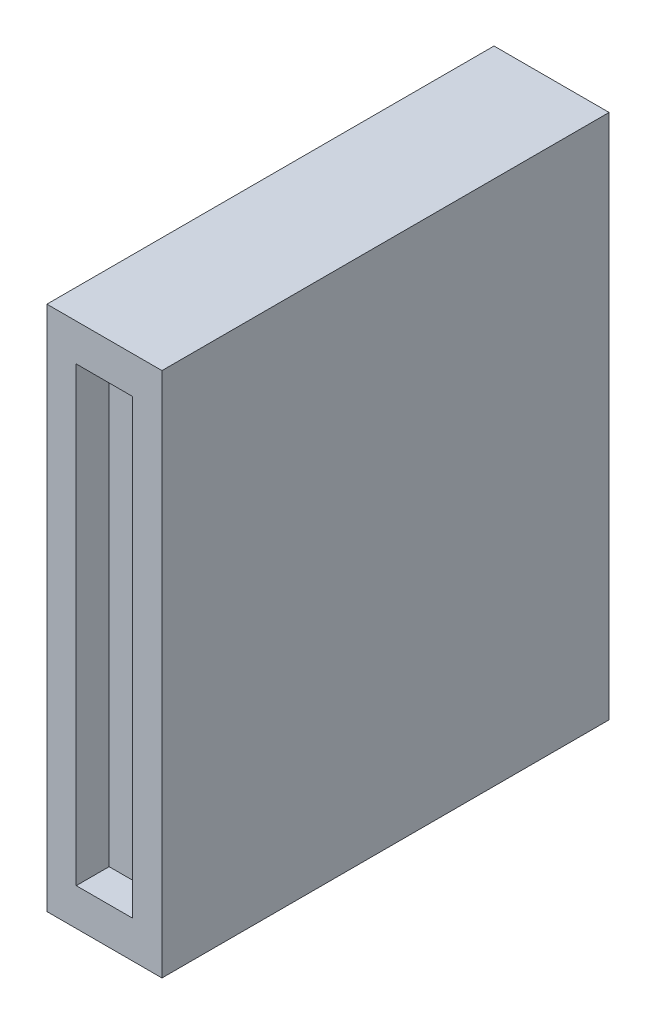
ISO-10303-21;
HEADER;
FILE_DESCRIPTION(('STEP AP214'),'2;1');
FILE_NAME('part.step','',(''),(''),'','','');
FILE_SCHEMA(('AUTOMOTIVE_DESIGN { 1 0 10303 214 1 1 1 1 }'));
ENDSEC;
DATA;
#1=APPLICATION_CONTEXT('core data for automotive mechanical design processes');
#2=APPLICATION_PROTOCOL_DEFINITION('international standard','automotive_design',2000,#1);
#3=PRODUCT_CONTEXT('',#1,'mechanical');
#4=PRODUCT('Part','Part','',(#3));
#5=PRODUCT_RELATED_PRODUCT_CATEGORY('part','',(#4));
#6=PRODUCT_DEFINITION_FORMATION('','',#4);
#7=PRODUCT_DEFINITION_CONTEXT('part definition',#1,'design');
#8=PRODUCT_DEFINITION('design','',#6,#7);
#9=PRODUCT_DEFINITION_SHAPE('','',#8);
#10=(LENGTH_UNIT() NAMED_UNIT(*) SI_UNIT(.MILLI.,.METRE.));
#11=(NAMED_UNIT(*) PLANE_ANGLE_UNIT() SI_UNIT($,.RADIAN.));
#12=(NAMED_UNIT(*) SI_UNIT($,.STERADIAN.) SOLID_ANGLE_UNIT());
#13=UNCERTAINTY_MEASURE_WITH_UNIT(LENGTH_MEASURE(1.E-05),#10,'distance_accuracy_value','');
#14=(GEOMETRIC_REPRESENTATION_CONTEXT(3) GLOBAL_UNCERTAINTY_ASSIGNED_CONTEXT((#13)) GLOBAL_UNIT_ASSIGNED_CONTEXT((#10,
#11,#12)) REPRESENTATION_CONTEXT('',''));
#15=CARTESIAN_POINT('',(0.,0.,0.));
#16=DIRECTION('',(0.,0.,1.));
#17=DIRECTION('',(1.,0.,0.));
#18=AXIS2_PLACEMENT_3D('',#15,#16,#17);
#19=CARTESIAN_POINT('',(8.75,-40.,68.));
#20=DIRECTION('',(-1.,0.,0.));
#21=DIRECTION('',(0.,0.,1.));
#22=AXIS2_PLACEMENT_3D('',#19,#20,#21);
#23=PLANE('',#22);
#24=DIRECTION('',(0.,1.,0.));
#25=VECTOR('',#24,1.);
#26=CARTESIAN_POINT('',(8.75,-40.,0.));
#27=LINE('',#26,#25);
#28=CARTESIAN_POINT('',(8.75,-40.,0.));
#29=VERTEX_POINT('',#28);
#30=CARTESIAN_POINT('',(8.75,40.,0.));
#31=VERTEX_POINT('',#30);
#32=EDGE_CURVE('E141',#29,#31,#27,.T.);
#33=ORIENTED_EDGE('',*,*,#32,.T.);
#34=DIRECTION('',(0.,0.,-1.));
#35=VECTOR('',#34,1.);
#36=CARTESIAN_POINT('',(8.75,40.,68.));
#37=LINE('',#36,#35);
#38=CARTESIAN_POINT('',(8.75,40.,68.));
#39=VERTEX_POINT('',#38);
#40=EDGE_CURVE('E11',#39,#31,#37,.T.);
#41=ORIENTED_EDGE('',*,*,#40,.F.);
#42=DIRECTION('',(0.,1.,0.));
#43=VECTOR('',#42,1.);
#44=CARTESIAN_POINT('',(8.75,-40.,68.));
#45=LINE('',#44,#43);
#46=CARTESIAN_POINT('',(8.75,-40.,68.));
#47=VERTEX_POINT('',#46);
#48=EDGE_CURVE('E145',#47,#39,#45,.T.);
#49=ORIENTED_EDGE('',*,*,#48,.F.);
#50=DIRECTION('',(0.,0.,-1.));
#51=VECTOR('',#50,1.);
#52=CARTESIAN_POINT('',(8.75,-40.,68.));
#53=LINE('',#52,#51);
#54=EDGE_CURVE('E151',#47,#29,#53,.T.);
#55=ORIENTED_EDGE('',*,*,#54,.T.);
#56=EDGE_LOOP('',(#33,#41,#49,#55));
#57=FACE_BOUND('',#56,.T.);
#58=ADVANCED_FACE('F33',(#57),#23,.F.);
#59=CARTESIAN_POINT('',(-8.75,40.,68.));
#60=DIRECTION('',(0.,-1.,0.));
#61=DIRECTION('',(0.,0.,-1.));
#62=AXIS2_PLACEMENT_3D('',#59,#60,#61);
#63=PLANE('',#62);
#64=DIRECTION('',(-1.,0.,0.));
#65=VECTOR('',#64,1.);
#66=CARTESIAN_POINT('',(-8.75,40.,0.));
#67=LINE('',#66,#65);
#68=CARTESIAN_POINT('',(-8.75,40.,0.));
#69=VERTEX_POINT('',#68);
#70=EDGE_CURVE('E154',#31,#69,#67,.T.);
#71=ORIENTED_EDGE('',*,*,#70,.T.);
#72=DIRECTION('',(0.,0.,-1.));
#73=VECTOR('',#72,1.);
#74=CARTESIAN_POINT('',(-8.75,40.,68.));
#75=LINE('',#74,#73);
#76=CARTESIAN_POINT('',(-8.75,40.,68.));
#77=VERTEX_POINT('',#76);
#78=EDGE_CURVE('E40',#77,#69,#75,.T.);
#79=ORIENTED_EDGE('',*,*,#78,.F.);
#80=DIRECTION('',(-1.,0.,0.));
#81=VECTOR('',#80,1.);
#82=CARTESIAN_POINT('',(-8.75,40.,68.));
#83=LINE('',#82,#81);
#84=EDGE_CURVE('E84',#39,#77,#83,.T.);
#85=ORIENTED_EDGE('',*,*,#84,.F.);
#86=ORIENTED_EDGE('',*,*,#40,.T.);
#87=EDGE_LOOP('',(#71,#79,#85,#86));
#88=FACE_BOUND('',#87,.T.);
#89=ADVANCED_FACE('F183',(#88),#63,.F.);
#90=CARTESIAN_POINT('',(-8.75,-40.,68.));
#91=DIRECTION('',(1.,0.,0.));
#92=DIRECTION('',(0.,0.,-1.));
#93=AXIS2_PLACEMENT_3D('',#90,#91,#92);
#94=PLANE('',#93);
#95=DIRECTION('',(0.,-1.,0.));
#96=VECTOR('',#95,1.);
#97=CARTESIAN_POINT('',(-8.75,-40.,0.));
#98=LINE('',#97,#96);
#99=CARTESIAN_POINT('',(-8.75,-40.,0.));
#100=VERTEX_POINT('',#99);
#101=EDGE_CURVE('E156',#69,#100,#98,.T.);
#102=ORIENTED_EDGE('',*,*,#101,.T.);
#103=DIRECTION('',(0.,0.,-1.));
#104=VECTOR('',#103,1.);
#105=CARTESIAN_POINT('',(-8.75,-40.,68.));
#106=LINE('',#105,#104);
#107=CARTESIAN_POINT('',(-8.75,-40.,68.));
#108=VERTEX_POINT('',#107);
#109=EDGE_CURVE('E160',#108,#100,#106,.T.);
#110=ORIENTED_EDGE('',*,*,#109,.F.);
#111=DIRECTION('',(0.,-1.,0.));
#112=VECTOR('',#111,1.);
#113=CARTESIAN_POINT('',(-8.75,-40.,68.));
#114=LINE('',#113,#112);
#115=EDGE_CURVE('E148',#77,#108,#114,.T.);
#116=ORIENTED_EDGE('',*,*,#115,.F.);
#117=ORIENTED_EDGE('',*,*,#78,.T.);
#118=EDGE_LOOP('',(#102,#110,#116,#117));
#119=FACE_BOUND('',#118,.T.);
#120=ADVANCED_FACE('F165',(#119),#94,.F.);
#121=CARTESIAN_POINT('',(-8.75,-40.,68.));
#122=DIRECTION('',(0.,1.,0.));
#123=DIRECTION('',(0.,0.,1.));
#124=AXIS2_PLACEMENT_3D('',#121,#122,#123);
#125=PLANE('',#124);
#126=DIRECTION('',(1.,0.,0.));
#127=VECTOR('',#126,1.);
#128=CARTESIAN_POINT('',(-8.75,-40.,0.));
#129=LINE('',#128,#127);
#130=EDGE_CURVE('E77',#100,#29,#129,.T.);
#131=ORIENTED_EDGE('',*,*,#130,.T.);
#132=ORIENTED_EDGE('',*,*,#54,.F.);
#133=DIRECTION('',(1.,0.,0.));
#134=VECTOR('',#133,1.);
#135=CARTESIAN_POINT('',(-8.75,-40.,68.));
#136=LINE('',#135,#134);
#137=EDGE_CURVE('E56',#108,#47,#136,.T.);
#138=ORIENTED_EDGE('',*,*,#137,.F.);
#139=ORIENTED_EDGE('',*,*,#109,.T.);
#140=EDGE_LOOP('',(#131,#132,#138,#139));
#141=FACE_BOUND('',#140,.T.);
#142=ADVANCED_FACE('F173',(#141),#125,.F.);
#143=CARTESIAN_POINT('',(0.,0.,68.));
#144=DIRECTION('',(0.,0.,-1.));
#145=DIRECTION('',(-1.,0.,0.));
#146=AXIS2_PLACEMENT_3D('',#143,#144,#145);
#147=PLANE('',#146);
#148=DIRECTION('',(-1.,0.,0.));
#149=VECTOR('',#148,1.);
#150=CARTESIAN_POINT('',(-4.28813383418714,34.3571997309091,68.));
#151=LINE('',#150,#149);
#152=CARTESIAN_POINT('',(4.28813383418714,34.3571997309091,68.));
#153=VERTEX_POINT('',#152);
#154=CARTESIAN_POINT('',(-4.28813383418714,34.3571997309091,68.));
#155=VERTEX_POINT('',#154);
#156=EDGE_CURVE('E135',#153,#155,#151,.T.);
#157=ORIENTED_EDGE('',*,*,#156,.F.);
#158=DIRECTION('',(0.,1.,0.));
#159=VECTOR('',#158,1.);
#160=CARTESIAN_POINT('',(4.28813383418714,-34.3571997309091,68.));
#161=LINE('',#160,#159);
#162=CARTESIAN_POINT('',(4.28813383418714,-34.3571997309091,68.));
#163=VERTEX_POINT('',#162);
#164=EDGE_CURVE('E47',#163,#153,#161,.T.);
#165=ORIENTED_EDGE('',*,*,#164,.F.);
#166=DIRECTION('',(1.,0.,0.));
#167=VECTOR('',#166,1.);
#168=CARTESIAN_POINT('',(-4.28813383418714,-34.3571997309091,68.));
#169=LINE('',#168,#167);
#170=CARTESIAN_POINT('',(-4.28813383418714,-34.3571997309091,68.));
#171=VERTEX_POINT('',#170);
#172=EDGE_CURVE('E126',#171,#163,#169,.T.);
#173=ORIENTED_EDGE('',*,*,#172,.F.);
#174=DIRECTION('',(0.,-1.,0.));
#175=VECTOR('',#174,1.);
#176=CARTESIAN_POINT('',(-4.28813383418714,-34.3571997309091,68.));
#177=LINE('',#176,#175);
#178=EDGE_CURVE('E129',#155,#171,#177,.T.);
#179=ORIENTED_EDGE('',*,*,#178,.F.);
#180=EDGE_LOOP('',(#157,#165,#173,#179));
#181=FACE_BOUND('',#180,.T.);
#182=ORIENTED_EDGE('',*,*,#48,.T.);
#183=ORIENTED_EDGE('',*,*,#84,.T.);
#184=ORIENTED_EDGE('',*,*,#115,.T.);
#185=ORIENTED_EDGE('',*,*,#137,.T.);
#186=EDGE_LOOP('',(#182,#183,#184,#185));
#187=FACE_BOUND('',#186,.T.);
#188=ADVANCED_FACE('F175',(#181,#187),#147,.F.);
#189=CARTESIAN_POINT('',(0.,0.,0.));
#190=DIRECTION('',(0.,0.,-1.));
#191=DIRECTION('',(-1.,0.,0.));
#192=AXIS2_PLACEMENT_3D('',#189,#190,#191);
#193=PLANE('',#192);
#194=ORIENTED_EDGE('',*,*,#32,.F.);
#195=ORIENTED_EDGE('',*,*,#130,.F.);
#196=ORIENTED_EDGE('',*,*,#101,.F.);
#197=ORIENTED_EDGE('',*,*,#70,.F.);
#198=EDGE_LOOP('',(#194,#195,#196,#197));
#199=FACE_BOUND('',#198,.T.);
#200=ADVANCED_FACE('F169',(#199),#193,.T.);
#201=CARTESIAN_POINT('',(4.28813383418714,-34.3571997309091,63.));
#202=DIRECTION('',(1.,0.,0.));
#203=DIRECTION('',(0.,0.,-1.));
#204=AXIS2_PLACEMENT_3D('',#201,#202,#203);
#205=PLANE('',#204);
#206=ORIENTED_EDGE('',*,*,#164,.T.);
#207=DIRECTION('',(0.,0.,1.));
#208=VECTOR('',#207,1.);
#209=CARTESIAN_POINT('',(4.28813383418714,34.3571997309091,63.));
#210=LINE('',#209,#208);
#211=CARTESIAN_POINT('',(4.28813383418714,34.3571997309091,63.));
#212=VERTEX_POINT('',#211);
#213=EDGE_CURVE('E104',#212,#153,#210,.T.);
#214=ORIENTED_EDGE('',*,*,#213,.F.);
#215=DIRECTION('',(0.,1.,0.));
#216=VECTOR('',#215,1.);
#217=CARTESIAN_POINT('',(4.28813383418714,-34.3571997309091,63.));
#218=LINE('',#217,#216);
#219=CARTESIAN_POINT('',(4.28813383418714,-34.3571997309091,63.));
#220=VERTEX_POINT('',#219);
#221=EDGE_CURVE('E108',#220,#212,#218,.T.);
#222=ORIENTED_EDGE('',*,*,#221,.F.);
#223=DIRECTION('',(0.,0.,1.));
#224=VECTOR('',#223,1.);
#225=CARTESIAN_POINT('',(4.28813383418714,-34.3571997309091,63.));
#226=LINE('',#225,#224);
#227=EDGE_CURVE('E139',#220,#163,#226,.T.);
#228=ORIENTED_EDGE('',*,*,#227,.T.);
#229=EDGE_LOOP('',(#206,#214,#222,#228));
#230=FACE_BOUND('',#229,.T.);
#231=ADVANCED_FACE('F106',(#230),#205,.F.);
#232=CARTESIAN_POINT('',(-4.28813383418714,-34.3571997309091,63.));
#233=DIRECTION('',(0.,-1.,0.));
#234=DIRECTION('',(0.,0.,-1.));
#235=AXIS2_PLACEMENT_3D('',#232,#233,#234);
#236=PLANE('',#235);
#237=ORIENTED_EDGE('',*,*,#172,.T.);
#238=ORIENTED_EDGE('',*,*,#227,.F.);
#239=DIRECTION('',(1.,0.,0.));
#240=VECTOR('',#239,1.);
#241=CARTESIAN_POINT('',(-4.28813383418714,-34.3571997309091,63.));
#242=LINE('',#241,#240);
#243=CARTESIAN_POINT('',(-4.28813383418714,-34.3571997309091,63.));
#244=VERTEX_POINT('',#243);
#245=EDGE_CURVE('E114',#244,#220,#242,.T.);
#246=ORIENTED_EDGE('',*,*,#245,.F.);
#247=DIRECTION('',(0.,0.,1.));
#248=VECTOR('',#247,1.);
#249=CARTESIAN_POINT('',(-4.28813383418714,-34.3571997309091,63.));
#250=LINE('',#249,#248);
#251=EDGE_CURVE('E142',#244,#171,#250,.T.);
#252=ORIENTED_EDGE('',*,*,#251,.T.);
#253=EDGE_LOOP('',(#237,#238,#246,#252));
#254=FACE_BOUND('',#253,.T.);
#255=ADVANCED_FACE('F222',(#254),#236,.F.);
#256=CARTESIAN_POINT('',(-4.28813383418714,-34.3571997309091,63.));
#257=DIRECTION('',(-1.,0.,0.));
#258=DIRECTION('',(0.,0.,1.));
#259=AXIS2_PLACEMENT_3D('',#256,#257,#258);
#260=PLANE('',#259);
#261=ORIENTED_EDGE('',*,*,#178,.T.);
#262=ORIENTED_EDGE('',*,*,#251,.F.);
#263=DIRECTION('',(0.,-1.,0.));
#264=VECTOR('',#263,1.);
#265=CARTESIAN_POINT('',(-4.28813383418714,-34.3571997309091,63.));
#266=LINE('',#265,#264);
#267=CARTESIAN_POINT('',(-4.28813383418714,34.3571997309091,63.));
#268=VERTEX_POINT('',#267);
#269=EDGE_CURVE('E122',#268,#244,#266,.T.);
#270=ORIENTED_EDGE('',*,*,#269,.F.);
#271=DIRECTION('',(0.,0.,1.));
#272=VECTOR('',#271,1.);
#273=CARTESIAN_POINT('',(-4.28813383418714,34.3571997309091,63.));
#274=LINE('',#273,#272);
#275=EDGE_CURVE('E113',#268,#155,#274,.T.);
#276=ORIENTED_EDGE('',*,*,#275,.T.);
#277=EDGE_LOOP('',(#261,#262,#270,#276));
#278=FACE_BOUND('',#277,.T.);
#279=ADVANCED_FACE('F231',(#278),#260,.F.);
#280=CARTESIAN_POINT('',(-4.28813383418714,34.3571997309091,63.));
#281=DIRECTION('',(0.,1.,0.));
#282=DIRECTION('',(0.,0.,1.));
#283=AXIS2_PLACEMENT_3D('',#280,#281,#282);
#284=PLANE('',#283);
#285=ORIENTED_EDGE('',*,*,#156,.T.);
#286=ORIENTED_EDGE('',*,*,#275,.F.);
#287=DIRECTION('',(-1.,0.,0.));
#288=VECTOR('',#287,1.);
#289=CARTESIAN_POINT('',(-4.28813383418714,34.3571997309091,63.));
#290=LINE('',#289,#288);
#291=EDGE_CURVE('E117',#212,#268,#290,.T.);
#292=ORIENTED_EDGE('',*,*,#291,.F.);
#293=ORIENTED_EDGE('',*,*,#213,.T.);
#294=EDGE_LOOP('',(#285,#286,#292,#293));
#295=FACE_BOUND('',#294,.T.);
#296=ADVANCED_FACE('F118',(#295),#284,.F.);
#297=CARTESIAN_POINT('',(0.,0.,63.));
#298=DIRECTION('',(0.,0.,-1.));
#299=DIRECTION('',(-1.,0.,0.));
#300=AXIS2_PLACEMENT_3D('',#297,#298,#299);
#301=PLANE('',#300);
#302=ORIENTED_EDGE('',*,*,#221,.T.);
#303=ORIENTED_EDGE('',*,*,#291,.T.);
#304=ORIENTED_EDGE('',*,*,#269,.T.);
#305=ORIENTED_EDGE('',*,*,#245,.T.);
#306=EDGE_LOOP('',(#302,#303,#304,#305));
#307=FACE_BOUND('',#306,.T.);
#308=ADVANCED_FACE('F124',(#307),#301,.F.);
#309=CLOSED_SHELL('',(#58,#89,#120,#142,#188,#200,#231,#255,#279,#296,#308));
#310=MANIFOLD_SOLID_BREP('B2',#309);
#311=ADVANCED_BREP_SHAPE_REPRESENTATION('',(#18,#310),#14);
#312=SHAPE_DEFINITION_REPRESENTATION(#9,#311);
ENDSEC;
END-ISO-10303-21;
